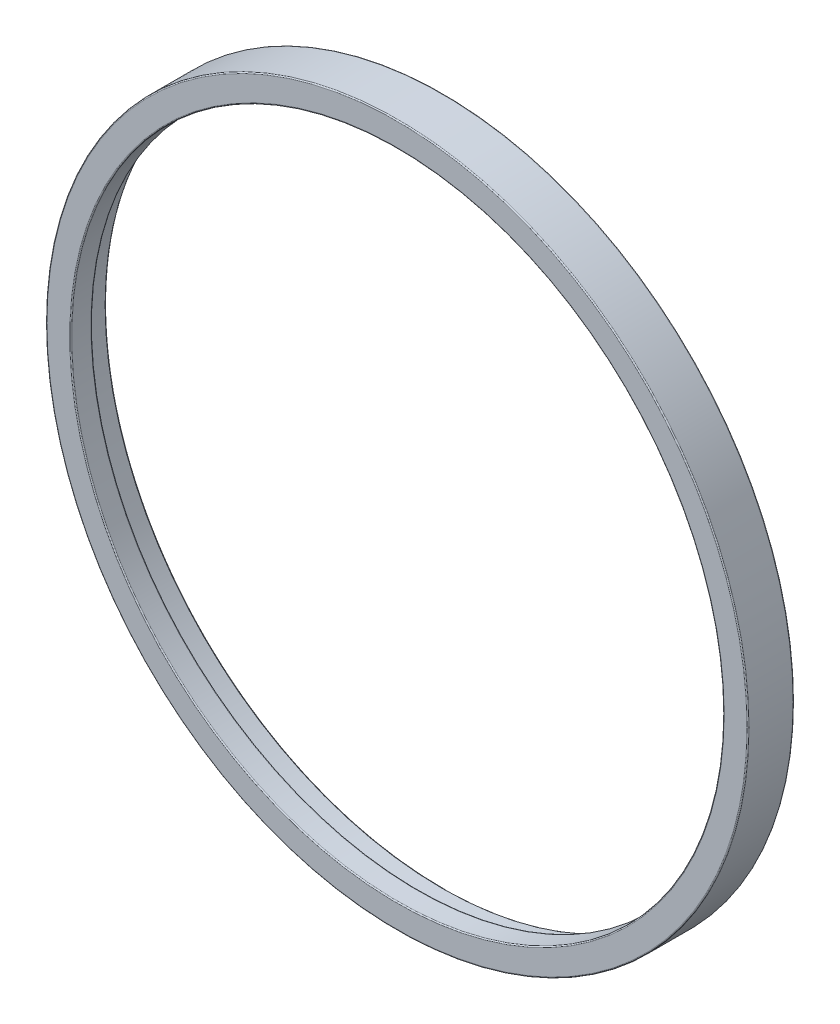
ISO-10303-21;
HEADER;
FILE_DESCRIPTION(('STEP AP214'),'2;1');
FILE_NAME('part.step','',(''),(''),'','','');
FILE_SCHEMA(('AUTOMOTIVE_DESIGN { 1 0 10303 214 1 1 1 1 }'));
ENDSEC;
DATA;
#1=APPLICATION_CONTEXT('core data for automotive mechanical design processes');
#2=APPLICATION_PROTOCOL_DEFINITION('international standard','automotive_design',2000,#1);
#3=PRODUCT_CONTEXT('',#1,'mechanical');
#4=PRODUCT('Part','Part','',(#3));
#5=PRODUCT_RELATED_PRODUCT_CATEGORY('part','',(#4));
#6=PRODUCT_DEFINITION_FORMATION('','',#4);
#7=PRODUCT_DEFINITION_CONTEXT('part definition',#1,'design');
#8=PRODUCT_DEFINITION('design','',#6,#7);
#9=PRODUCT_DEFINITION_SHAPE('','',#8);
#10=(LENGTH_UNIT() NAMED_UNIT(*) SI_UNIT(.MILLI.,.METRE.));
#11=(NAMED_UNIT(*) PLANE_ANGLE_UNIT() SI_UNIT($,.RADIAN.));
#12=(NAMED_UNIT(*) SI_UNIT($,.STERADIAN.) SOLID_ANGLE_UNIT());
#13=UNCERTAINTY_MEASURE_WITH_UNIT(LENGTH_MEASURE(1.E-05),#10,'distance_accuracy_value','');
#14=(GEOMETRIC_REPRESENTATION_CONTEXT(3) GLOBAL_UNCERTAINTY_ASSIGNED_CONTEXT((#13)) GLOBAL_UNIT_ASSIGNED_CONTEXT((#10,
#11,#12)) REPRESENTATION_CONTEXT('',''));
#15=CARTESIAN_POINT('',(0.,0.,0.));
#16=DIRECTION('',(0.,0.,1.));
#17=DIRECTION('',(1.,0.,0.));
#18=AXIS2_PLACEMENT_3D('',#15,#16,#17);
#19=CARTESIAN_POINT('',(0.,0.,-2.85));
#20=DIRECTION('',(0.,0.,1.));
#21=DIRECTION('',(1.,0.,0.));
#22=AXIS2_PLACEMENT_3D('',#19,#20,#21);
#23=TOROIDAL_SURFACE('',#22,46.15,0.149999999999999);
#24=CARTESIAN_POINT('',(0.,0.,-3.));
#25=DIRECTION('',(0.,0.,1.));
#26=DIRECTION('',(1.,0.,0.));
#27=AXIS2_PLACEMENT_3D('',#24,#25,#26);
#28=CIRCLE('',#27,46.15);
#29=CARTESIAN_POINT('',(46.15,0.,-3.));
#30=VERTEX_POINT('',#29);
#31=EDGE_CURVE('E10',#30,#30,#28,.T.);
#32=ORIENTED_EDGE('',*,*,#31,.F.);
#33=EDGE_LOOP('',(#32));
#34=FACE_BOUND('',#33,.T.);
#35=CARTESIAN_POINT('',(0.,0.,-2.85));
#36=DIRECTION('',(0.,0.,1.));
#37=DIRECTION('',(1.,0.,0.));
#38=AXIS2_PLACEMENT_3D('',#35,#36,#37);
#39=CIRCLE('',#38,46.);
#40=CARTESIAN_POINT('',(46.,0.,-2.85));
#41=VERTEX_POINT('',#40);
#42=EDGE_CURVE('E92',#41,#41,#39,.T.);
#43=ORIENTED_EDGE('',*,*,#42,.T.);
#44=EDGE_LOOP('',(#43));
#45=FACE_BOUND('',#44,.T.);
#46=ADVANCED_FACE('F41',(#34,#45),#23,.T.);
#47=CARTESIAN_POINT('',(0.,46.15,-3.));
#48=DIRECTION('',(0.,0.,1.));
#49=DIRECTION('',(1.,0.,0.));
#50=AXIS2_PLACEMENT_3D('',#47,#48,#49);
#51=PLANE('',#50);
#52=CARTESIAN_POINT('',(0.,0.,-3.));
#53=DIRECTION('',(0.,0.,1.));
#54=DIRECTION('',(1.,0.,0.));
#55=AXIS2_PLACEMENT_3D('',#52,#53,#54);
#56=CIRCLE('',#55,47.35);
#57=CARTESIAN_POINT('',(47.35,0.,-3.));
#58=VERTEX_POINT('',#57);
#59=EDGE_CURVE('E48',#58,#58,#56,.T.);
#60=ORIENTED_EDGE('',*,*,#59,.F.);
#61=EDGE_LOOP('',(#60));
#62=FACE_BOUND('',#61,.T.);
#63=ORIENTED_EDGE('',*,*,#31,.T.);
#64=EDGE_LOOP('',(#63));
#65=FACE_BOUND('',#64,.T.);
#66=ADVANCED_FACE('F154',(#62,#65),#51,.F.);
#67=CARTESIAN_POINT('',(0.,0.,-3.15));
#68=DIRECTION('',(0.,0.,1.));
#69=DIRECTION('',(1.,0.,0.));
#70=AXIS2_PLACEMENT_3D('',#67,#68,#69);
#71=TOROIDAL_SURFACE('',#70,47.35,0.149999999999999);
#72=CARTESIAN_POINT('',(0.,0.,-3.15));
#73=DIRECTION('',(0.,0.,1.));
#74=DIRECTION('',(1.,0.,0.));
#75=AXIS2_PLACEMENT_3D('',#72,#73,#74);
#76=CIRCLE('',#75,47.5);
#77=CARTESIAN_POINT('',(47.5,0.,-3.15));
#78=VERTEX_POINT('',#77);
#79=EDGE_CURVE('E53',#78,#78,#76,.T.);
#80=ORIENTED_EDGE('',*,*,#79,.F.);
#81=EDGE_LOOP('',(#80));
#82=FACE_BOUND('',#81,.T.);
#83=ORIENTED_EDGE('',*,*,#59,.T.);
#84=EDGE_LOOP('',(#83));
#85=FACE_BOUND('',#84,.T.);
#86=ADVANCED_FACE('F149',(#82,#85),#71,.F.);
#87=CARTESIAN_POINT('',(0.,0.,28.1791767554479));
#88=DIRECTION('',(0.,0.,1.));
#89=DIRECTION('',(1.,0.,0.));
#90=AXIS2_PLACEMENT_3D('',#87,#88,#89);
#91=CYLINDRICAL_SURFACE('',#90,47.5);
#92=CARTESIAN_POINT('',(0.,0.,-6.35));
#93=DIRECTION('',(0.,0.,1.));
#94=DIRECTION('',(1.,0.,0.));
#95=AXIS2_PLACEMENT_3D('',#92,#93,#94);
#96=CIRCLE('',#95,47.5);
#97=CARTESIAN_POINT('',(47.5,0.,-6.35));
#98=VERTEX_POINT('',#97);
#99=EDGE_CURVE('E58',#98,#98,#96,.T.);
#100=ORIENTED_EDGE('',*,*,#99,.F.);
#101=EDGE_LOOP('',(#100));
#102=FACE_BOUND('',#101,.T.);
#103=ORIENTED_EDGE('',*,*,#79,.T.);
#104=EDGE_LOOP('',(#103));
#105=FACE_BOUND('',#104,.T.);
#106=ADVANCED_FACE('F143',(#102,#105),#91,.F.);
#107=CARTESIAN_POINT('',(0.,0.,-6.35));
#108=DIRECTION('',(0.,0.,1.));
#109=DIRECTION('',(1.,0.,0.));
#110=AXIS2_PLACEMENT_3D('',#107,#108,#109);
#111=TOROIDAL_SURFACE('',#110,47.65,0.149999999999999);
#112=CARTESIAN_POINT('',(0.,0.,-6.5));
#113=DIRECTION('',(0.,0.,1.));
#114=DIRECTION('',(1.,0.,0.));
#115=AXIS2_PLACEMENT_3D('',#112,#113,#114);
#116=CIRCLE('',#115,47.65);
#117=CARTESIAN_POINT('',(47.65,0.,-6.5));
#118=VERTEX_POINT('',#117);
#119=EDGE_CURVE('E64',#118,#118,#116,.T.);
#120=ORIENTED_EDGE('',*,*,#119,.F.);
#121=EDGE_LOOP('',(#120));
#122=FACE_BOUND('',#121,.T.);
#123=ORIENTED_EDGE('',*,*,#99,.T.);
#124=EDGE_LOOP('',(#123));
#125=FACE_BOUND('',#124,.T.);
#126=ADVANCED_FACE('F137',(#122,#125),#111,.T.);
#127=CARTESIAN_POINT('',(0.,47.65,-6.5));
#128=DIRECTION('',(0.,0.,1.));
#129=DIRECTION('',(1.,0.,0.));
#130=AXIS2_PLACEMENT_3D('',#127,#128,#129);
#131=PLANE('',#130);
#132=CARTESIAN_POINT('',(0.,0.,-6.5));
#133=DIRECTION('',(0.,0.,1.));
#134=DIRECTION('',(1.,0.,0.));
#135=AXIS2_PLACEMENT_3D('',#132,#133,#134);
#136=CIRCLE('',#135,49.35);
#137=CARTESIAN_POINT('',(49.35,0.,-6.5));
#138=VERTEX_POINT('',#137);
#139=EDGE_CURVE('E68',#138,#138,#136,.T.);
#140=ORIENTED_EDGE('',*,*,#139,.F.);
#141=EDGE_LOOP('',(#140));
#142=FACE_BOUND('',#141,.T.);
#143=ORIENTED_EDGE('',*,*,#119,.T.);
#144=EDGE_LOOP('',(#143));
#145=FACE_BOUND('',#144,.T.);
#146=ADVANCED_FACE('F131',(#142,#145),#131,.F.);
#147=CARTESIAN_POINT('',(0.,0.,-6.35));
#148=DIRECTION('',(0.,0.,1.));
#149=DIRECTION('',(1.,0.,0.));
#150=AXIS2_PLACEMENT_3D('',#147,#148,#149);
#151=TOROIDAL_SURFACE('',#150,49.35,0.149999999999999);
#152=CARTESIAN_POINT('',(0.,0.,-6.35));
#153=DIRECTION('',(0.,0.,1.));
#154=DIRECTION('',(1.,0.,0.));
#155=AXIS2_PLACEMENT_3D('',#152,#153,#154);
#156=CIRCLE('',#155,49.5);
#157=CARTESIAN_POINT('',(49.5,0.,-6.35));
#158=VERTEX_POINT('',#157);
#159=EDGE_CURVE('E72',#158,#158,#156,.T.);
#160=ORIENTED_EDGE('',*,*,#159,.F.);
#161=EDGE_LOOP('',(#160));
#162=FACE_BOUND('',#161,.T.);
#163=ORIENTED_EDGE('',*,*,#139,.T.);
#164=EDGE_LOOP('',(#163));
#165=FACE_BOUND('',#164,.T.);
#166=ADVANCED_FACE('F125',(#162,#165),#151,.T.);
#167=CARTESIAN_POINT('',(0.,0.,28.1791767554479));
#168=DIRECTION('',(0.,0.,1.));
#169=DIRECTION('',(1.,0.,0.));
#170=AXIS2_PLACEMENT_3D('',#167,#168,#169);
#171=CYLINDRICAL_SURFACE('',#170,49.5);
#172=CARTESIAN_POINT('',(0.,0.,-0.150000000000001));
#173=DIRECTION('',(0.,0.,1.));
#174=DIRECTION('',(1.,0.,0.));
#175=AXIS2_PLACEMENT_3D('',#172,#173,#174);
#176=CIRCLE('',#175,49.5);
#177=CARTESIAN_POINT('',(49.5,0.,-0.150000000000001));
#178=VERTEX_POINT('',#177);
#179=EDGE_CURVE('E76',#178,#178,#176,.T.);
#180=ORIENTED_EDGE('',*,*,#179,.F.);
#181=EDGE_LOOP('',(#180));
#182=FACE_BOUND('',#181,.T.);
#183=ORIENTED_EDGE('',*,*,#159,.T.);
#184=EDGE_LOOP('',(#183));
#185=FACE_BOUND('',#184,.T.);
#186=ADVANCED_FACE('F119',(#182,#185),#171,.T.);
#187=CARTESIAN_POINT('',(0.,0.,-0.15));
#188=DIRECTION('',(0.,0.,1.));
#189=DIRECTION('',(1.,0.,0.));
#190=AXIS2_PLACEMENT_3D('',#187,#188,#189);
#191=TOROIDAL_SURFACE('',#190,49.35,0.149999999999999);
#192=CARTESIAN_POINT('',(0.,0.,0.));
#193=DIRECTION('',(0.,0.,1.));
#194=DIRECTION('',(1.,0.,0.));
#195=AXIS2_PLACEMENT_3D('',#192,#193,#194);
#196=CIRCLE('',#195,49.35);
#197=CARTESIAN_POINT('',(49.35,0.,0.));
#198=VERTEX_POINT('',#197);
#199=EDGE_CURVE('E80',#198,#198,#196,.T.);
#200=ORIENTED_EDGE('',*,*,#199,.F.);
#201=EDGE_LOOP('',(#200));
#202=FACE_BOUND('',#201,.T.);
#203=ORIENTED_EDGE('',*,*,#179,.T.);
#204=EDGE_LOOP('',(#203));
#205=FACE_BOUND('',#204,.T.);
#206=ADVANCED_FACE('F113',(#202,#205),#191,.T.);
#207=CARTESIAN_POINT('',(0.,49.35,0.));
#208=DIRECTION('',(0.,0.,-1.));
#209=DIRECTION('',(-1.,0.,0.));
#210=AXIS2_PLACEMENT_3D('',#207,#208,#209);
#211=PLANE('',#210);
#212=CARTESIAN_POINT('',(0.,0.,0.));
#213=DIRECTION('',(0.,0.,1.));
#214=DIRECTION('',(1.,0.,0.));
#215=AXIS2_PLACEMENT_3D('',#212,#213,#214);
#216=CIRCLE('',#215,46.15);
#217=CARTESIAN_POINT('',(46.15,0.,0.));
#218=VERTEX_POINT('',#217);
#219=EDGE_CURVE('E84',#218,#218,#216,.T.);
#220=ORIENTED_EDGE('',*,*,#219,.F.);
#221=EDGE_LOOP('',(#220));
#222=FACE_BOUND('',#221,.T.);
#223=ORIENTED_EDGE('',*,*,#199,.T.);
#224=EDGE_LOOP('',(#223));
#225=FACE_BOUND('',#224,.T.);
#226=ADVANCED_FACE('F107',(#222,#225),#211,.F.);
#227=CARTESIAN_POINT('',(0.,0.,-0.15));
#228=DIRECTION('',(0.,0.,1.));
#229=DIRECTION('',(1.,0.,0.));
#230=AXIS2_PLACEMENT_3D('',#227,#228,#229);
#231=TOROIDAL_SURFACE('',#230,46.15,0.149999999999999);
#232=CARTESIAN_POINT('',(0.,0.,-0.150000000000001));
#233=DIRECTION('',(0.,0.,1.));
#234=DIRECTION('',(1.,0.,0.));
#235=AXIS2_PLACEMENT_3D('',#232,#233,#234);
#236=CIRCLE('',#235,46.);
#237=CARTESIAN_POINT('',(46.,0.,-0.150000000000001));
#238=VERTEX_POINT('',#237);
#239=EDGE_CURVE('E88',#238,#238,#236,.T.);
#240=ORIENTED_EDGE('',*,*,#239,.F.);
#241=EDGE_LOOP('',(#240));
#242=FACE_BOUND('',#241,.T.);
#243=ORIENTED_EDGE('',*,*,#219,.T.);
#244=EDGE_LOOP('',(#243));
#245=FACE_BOUND('',#244,.T.);
#246=ADVANCED_FACE('F101',(#242,#245),#231,.T.);
#247=CARTESIAN_POINT('',(0.,0.,28.1791767554479));
#248=DIRECTION('',(0.,0.,1.));
#249=DIRECTION('',(1.,0.,0.));
#250=AXIS2_PLACEMENT_3D('',#247,#248,#249);
#251=CYLINDRICAL_SURFACE('',#250,46.);
#252=ORIENTED_EDGE('',*,*,#42,.F.);
#253=EDGE_LOOP('',(#252));
#254=FACE_BOUND('',#253,.T.);
#255=ORIENTED_EDGE('',*,*,#239,.T.);
#256=EDGE_LOOP('',(#255));
#257=FACE_BOUND('',#256,.T.);
#258=ADVANCED_FACE('F98',(#254,#257),#251,.F.);
#259=CLOSED_SHELL('',(#46,#66,#86,#106,#126,#146,#166,#186,#206,#226,#246,#258));
#260=MANIFOLD_SOLID_BREP('B2',#259);
#261=ADVANCED_BREP_SHAPE_REPRESENTATION('',(#18,#260),#14);
#262=SHAPE_DEFINITION_REPRESENTATION(#9,#261);
ENDSEC;
END-ISO-10303-21;
